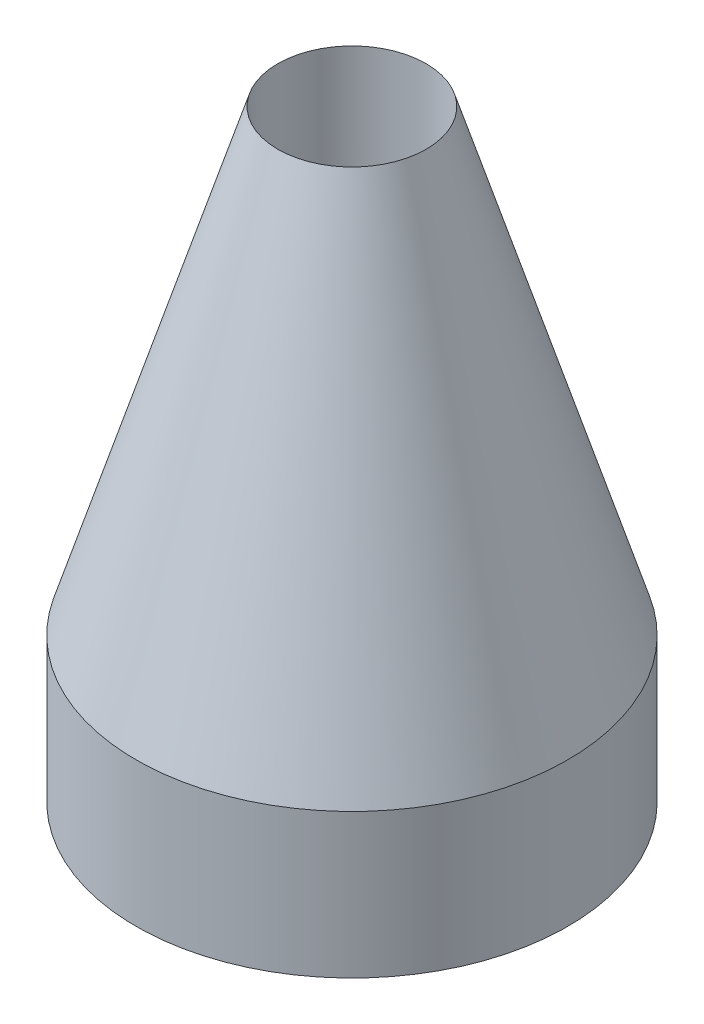
ISO-10303-21;
HEADER;
FILE_DESCRIPTION(('STEP AP214'),'2;1');
FILE_NAME('part.step','',(''),(''),'','','');
FILE_SCHEMA(('AUTOMOTIVE_DESIGN { 1 0 10303 214 1 1 1 1 }'));
ENDSEC;
DATA;
#1=APPLICATION_CONTEXT('core data for automotive mechanical design processes');
#2=APPLICATION_PROTOCOL_DEFINITION('international standard','automotive_design',2000,#1);
#3=PRODUCT_CONTEXT('',#1,'mechanical');
#4=PRODUCT('Part','Part','',(#3));
#5=PRODUCT_RELATED_PRODUCT_CATEGORY('part','',(#4));
#6=PRODUCT_DEFINITION_FORMATION('','',#4);
#7=PRODUCT_DEFINITION_CONTEXT('part definition',#1,'design');
#8=PRODUCT_DEFINITION('design','',#6,#7);
#9=PRODUCT_DEFINITION_SHAPE('','',#8);
#10=(LENGTH_UNIT() NAMED_UNIT(*) SI_UNIT(.MILLI.,.METRE.));
#11=(NAMED_UNIT(*) PLANE_ANGLE_UNIT() SI_UNIT($,.RADIAN.));
#12=(NAMED_UNIT(*) SI_UNIT($,.STERADIAN.) SOLID_ANGLE_UNIT());
#13=UNCERTAINTY_MEASURE_WITH_UNIT(LENGTH_MEASURE(1.E-05),#10,'distance_accuracy_value','');
#14=(GEOMETRIC_REPRESENTATION_CONTEXT(3) GLOBAL_UNCERTAINTY_ASSIGNED_CONTEXT((#13)) GLOBAL_UNIT_ASSIGNED_CONTEXT((#10,
#11,#12)) REPRESENTATION_CONTEXT('',''));
#15=CARTESIAN_POINT('',(0.,0.,0.));
#16=DIRECTION('',(0.,0.,1.));
#17=DIRECTION('',(1.,0.,0.));
#18=AXIS2_PLACEMENT_3D('',#15,#16,#17);
#19=CARTESIAN_POINT('',(0.,-1.71617021276596,0.));
#20=DIRECTION('',(0.,-1.,0.));
#21=DIRECTION('',(0.,0.,-1.));
#22=AXIS2_PLACEMENT_3D('',#19,#20,#21);
#23=CONICAL_SURFACE('',#22,41.4535089184806,0.299908689559744);
#24=CARTESIAN_POINT('',(0.,86.253829787234,0.));
#25=DIRECTION('',(0.,1.,0.));
#26=DIRECTION('',(0.,0.,1.));
#27=AXIS2_PLACEMENT_3D('',#24,#25,#26);
#28=CIRCLE('',#27,14.25);
#29=CARTESIAN_POINT('',(0.,86.253829787234,14.25));
#30=VERTEX_POINT('',#29);
#31=EDGE_CURVE('E44',#30,#30,#28,.T.);
#32=ORIENTED_EDGE('',*,*,#31,.F.);
#33=EDGE_LOOP('',(#32));
#34=FACE_BOUND('',#33,.T.);
#35=CARTESIAN_POINT('',(0.,-1.71617021276596,0.));
#36=DIRECTION('',(0.,-1.,0.));
#37=DIRECTION('',(0.,0.,-1.));
#38=AXIS2_PLACEMENT_3D('',#35,#36,#37);
#39=CIRCLE('',#38,41.4535089184806);
#40=CARTESIAN_POINT('',(0.,-1.71617021276596,-41.4535089184806));
#41=VERTEX_POINT('',#40);
#42=EDGE_CURVE('E10',#41,#41,#39,.T.);
#43=ORIENTED_EDGE('',*,*,#42,.F.);
#44=EDGE_LOOP('',(#43));
#45=FACE_BOUND('',#44,.T.);
#46=ADVANCED_FACE('F30',(#34,#45),#23,.T.);
#47=CARTESIAN_POINT('',(0.,-29.426170212766,0.));
#48=DIRECTION('',(0.,-1.,0.));
#49=DIRECTION('',(0.,0.,-1.));
#50=AXIS2_PLACEMENT_3D('',#47,#48,#49);
#51=CYLINDRICAL_SURFACE('',#50,41.4535089184806);
#52=ORIENTED_EDGE('',*,*,#42,.T.);
#53=EDGE_LOOP('',(#52));
#54=FACE_BOUND('',#53,.T.);
#55=CARTESIAN_POINT('',(0.,-29.426170212766,0.));
#56=DIRECTION('',(0.,-1.,0.));
#57=DIRECTION('',(0.,0.,-1.));
#58=AXIS2_PLACEMENT_3D('',#55,#56,#57);
#59=CIRCLE('',#58,41.4535089184806);
#60=CARTESIAN_POINT('',(0.,-29.426170212766,-41.4535089184806));
#61=VERTEX_POINT('',#60);
#62=EDGE_CURVE('E36',#61,#61,#59,.T.);
#63=ORIENTED_EDGE('',*,*,#62,.F.);
#64=EDGE_LOOP('',(#63));
#65=FACE_BOUND('',#64,.T.);
#66=ADVANCED_FACE('F54',(#54,#65),#51,.T.);
#67=CARTESIAN_POINT('',(0.,-29.426170212766,0.));
#68=DIRECTION('',(0.,-1.,0.));
#69=DIRECTION('',(0.,0.,-1.));
#70=AXIS2_PLACEMENT_3D('',#67,#68,#69);
#71=PLANE('',#70);
#72=ORIENTED_EDGE('',*,*,#62,.T.);
#73=EDGE_LOOP('',(#72));
#74=FACE_BOUND('',#73,.T.);
#75=ADVANCED_FACE('F58',(#74),#71,.T.);
#76=CARTESIAN_POINT('',(0.,-1.45617021276599,0.));
#77=DIRECTION('',(0.,1.,0.));
#78=DIRECTION('',(0.,0.,1.));
#79=AXIS2_PLACEMENT_3D('',#76,#77,#78);
#80=CYLINDRICAL_SURFACE('',#79,14.25);
#81=CARTESIAN_POINT('',(0.,-1.45617021276599,0.));
#82=DIRECTION('',(0.,1.,0.));
#83=DIRECTION('',(0.,0.,1.));
#84=AXIS2_PLACEMENT_3D('',#81,#82,#83);
#85=CIRCLE('',#84,14.25);
#86=CARTESIAN_POINT('',(0.,-1.45617021276599,14.25));
#87=VERTEX_POINT('',#86);
#88=EDGE_CURVE('E40',#87,#87,#85,.T.);
#89=CARTESIAN_POINT('',(0.,-1.45617021276599,14.25));
#90=CARTESIAN_POINT('',(0.,-0.542524379432658,14.25));
#91=CARTESIAN_POINT('',(0.,0.371121453900676,14.25));
#92=CARTESIAN_POINT('',(0.,2.19841312056734,14.25));
#93=CARTESIAN_POINT('',(0.,3.11205895390068,14.25));
#94=CARTESIAN_POINT('',(0.,4.93935062056734,14.25));
#95=CARTESIAN_POINT('',(0.,5.85299645390068,14.25));
#96=CARTESIAN_POINT('',(0.,7.68028812056734,14.25));
#97=CARTESIAN_POINT('',(0.,8.59393395390068,14.25));
#98=CARTESIAN_POINT('',(0.,10.4212256205673,14.25));
#99=CARTESIAN_POINT('',(0.,11.3348714539007,14.25));
#100=CARTESIAN_POINT('',(0.,13.1621631205673,14.25));
#101=CARTESIAN_POINT('',(0.,14.0758089539007,14.25));
#102=CARTESIAN_POINT('',(0.,15.9031006205673,14.25));
#103=CARTESIAN_POINT('',(0.,16.8167464539007,14.25));
#104=CARTESIAN_POINT('',(0.,18.6440381205673,14.25));
#105=CARTESIAN_POINT('',(0.,19.5576839539007,14.25));
#106=CARTESIAN_POINT('',(0.,21.3849756205673,14.25));
#107=CARTESIAN_POINT('',(0.,22.2986214539007,14.25));
#108=CARTESIAN_POINT('',(0.,24.1259131205674,14.25));
#109=CARTESIAN_POINT('',(0.,25.0395589539007,14.25));
#110=CARTESIAN_POINT('',(0.,26.8668506205674,14.25));
#111=CARTESIAN_POINT('',(0.,27.7804964539007,14.25));
#112=CARTESIAN_POINT('',(0.,29.6077881205673,14.25));
#113=CARTESIAN_POINT('',(0.,30.5214339539007,14.25));
#114=CARTESIAN_POINT('',(0.,32.3487256205674,14.25));
#115=CARTESIAN_POINT('',(0.,33.2623714539007,14.25));
#116=CARTESIAN_POINT('',(0.,35.0896631205673,14.25));
#117=CARTESIAN_POINT('',(0.,36.0033089539007,14.25));
#118=CARTESIAN_POINT('',(0.,37.8306006205674,14.25));
#119=CARTESIAN_POINT('',(0.,38.7442464539007,14.25));
#120=CARTESIAN_POINT('',(0.,40.5715381205674,14.25));
#121=CARTESIAN_POINT('',(0.,41.4851839539007,14.25));
#122=CARTESIAN_POINT('',(0.,43.3124756205673,14.25));
#123=CARTESIAN_POINT('',(0.,44.2261214539007,14.25));
#124=CARTESIAN_POINT('',(0.,46.0534131205674,14.25));
#125=CARTESIAN_POINT('',(0.,46.9670589539007,14.25));
#126=CARTESIAN_POINT('',(0.,48.7943506205674,14.25));
#127=CARTESIAN_POINT('',(0.,49.7079964539007,14.25));
#128=CARTESIAN_POINT('',(0.,51.5352881205674,14.25));
#129=CARTESIAN_POINT('',(0.,52.4489339539007,14.25));
#130=CARTESIAN_POINT('',(0.,54.2762256205674,14.25));
#131=CARTESIAN_POINT('',(0.,55.1898714539007,14.25));
#132=CARTESIAN_POINT('',(0.,57.0171631205674,14.25));
#133=CARTESIAN_POINT('',(0.,57.9308089539007,14.25));
#134=CARTESIAN_POINT('',(0.,59.7581006205674,14.25));
#135=CARTESIAN_POINT('',(0.,60.6717464539007,14.25));
#136=CARTESIAN_POINT('',(0.,62.4990381205673,14.25));
#137=CARTESIAN_POINT('',(0.,63.4126839539007,14.25));
#138=CARTESIAN_POINT('',(0.,65.2399756205673,14.25));
#139=CARTESIAN_POINT('',(0.,66.1536214539007,14.25));
#140=CARTESIAN_POINT('',(0.,67.9809131205674,14.25));
#141=CARTESIAN_POINT('',(0.,68.8945589539007,14.25));
#142=CARTESIAN_POINT('',(0.,70.7218506205674,14.25));
#143=CARTESIAN_POINT('',(0.,71.6354964539007,14.25));
#144=CARTESIAN_POINT('',(0.,73.4627881205674,14.25));
#145=CARTESIAN_POINT('',(0.,74.3764339539007,14.25));
#146=CARTESIAN_POINT('',(0.,76.2037256205674,14.25));
#147=CARTESIAN_POINT('',(0.,77.1173714539007,14.25));
#148=CARTESIAN_POINT('',(0.,78.9446631205674,14.25));
#149=CARTESIAN_POINT('',(0.,79.8583089539007,14.25));
#150=CARTESIAN_POINT('',(0.,81.6856006205674,14.25));
#151=CARTESIAN_POINT('',(0.,82.5992464539007,14.25));
#152=CARTESIAN_POINT('',(0.,84.4265381205674,14.25));
#153=CARTESIAN_POINT('',(0.,85.3401839539007,14.25));
#154=CARTESIAN_POINT('',(0.,86.253829787234,14.25));
#155=B_SPLINE_CURVE_WITH_KNOTS('',3,(#89,#90,#91,#92,#93,#94,#95,#96,#97,#98,#99,#100,#101,#102,
#103,#104,#105,#106,#107,#108,#109,#110,#111,#112,#113,#114,#115,#116,#117,#118,#119,#120,#121,
#122,#123,#124,#125,#126,#127,#128,#129,#130,#131,#132,#133,#134,#135,#136,#137,#138,#139,#140,
#141,#142,#143,#144,#145,#146,#147,#148,#149,#150,#151,#152,#153,#154),.UNSPECIFIED.,.F.,.F.,(4,
2,2,2,2,2,2,2,2,2,2,2,2,2,2,2,2,2,2,2,2,2,2,2,2,2,2,2,2,2,2,2,4),(0.,2.7409375,5.481875,
8.2228125,10.96375,13.7046875,16.445625,19.1865625,21.9275,24.6684375,27.409375,30.1503125,
32.89125,35.6321875,38.373125,41.1140625,43.855,46.5959375,49.336875,52.0778125,54.81875,
57.5596875,60.300625,63.0415625,65.7825,68.5234375,71.264375,74.0053125,76.74625,79.4871875,
82.228125,84.9690625,87.71),.UNSPECIFIED.);
#156=EDGE_CURVE('BSEAM50',#87,#30,#155,.T.);
#157=ORIENTED_EDGE('',*,*,#88,.F.);
#158=ORIENTED_EDGE('',*,*,#31,.T.);
#159=ORIENTED_EDGE('',*,*,#156,.T.);
#160=ORIENTED_EDGE('',*,*,#156,.F.);
#161=EDGE_LOOP('',(#157,#159,#158,#160));
#162=FACE_BOUND('',#161,.T.);
#163=ADVANCED_FACE('F50',(#162),#80,.F.);
#164=CARTESIAN_POINT('',(0.,-1.45617021276599,0.));
#165=DIRECTION('',(0.,1.,0.));
#166=DIRECTION('',(0.,0.,1.));
#167=AXIS2_PLACEMENT_3D('',#164,#165,#166);
#168=PLANE('',#167);
#169=ORIENTED_EDGE('',*,*,#88,.T.);
#170=EDGE_LOOP('',(#169));
#171=FACE_BOUND('',#170,.T.);
#172=ADVANCED_FACE('F67',(#171),#168,.T.);
#173=CLOSED_SHELL('',(#46,#66,#75,#163,#172));
#174=MANIFOLD_SOLID_BREP('B2',#173);
#175=ADVANCED_BREP_SHAPE_REPRESENTATION('',(#18,#174),#14);
#176=SHAPE_DEFINITION_REPRESENTATION(#9,#175);
ENDSEC;
END-ISO-10303-21;
